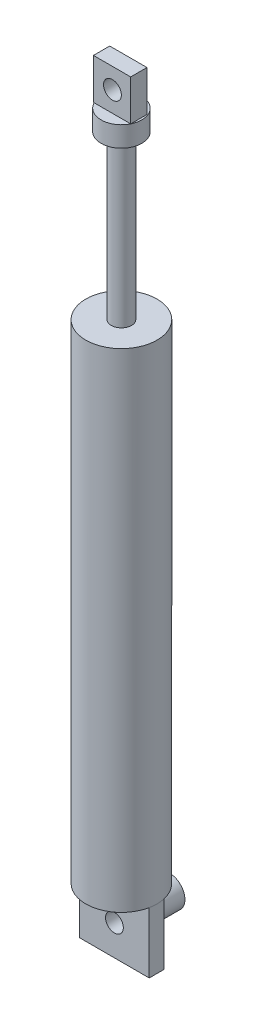
ISO-10303-21;
HEADER;
FILE_DESCRIPTION(('STEP AP214'),'2;1');
FILE_NAME('part.step','',(''),(''),'','','');
FILE_SCHEMA(('AUTOMOTIVE_DESIGN { 1 0 10303 214 1 1 1 1 }'));
ENDSEC;
DATA;
#1=APPLICATION_CONTEXT('core data for automotive mechanical design processes');
#2=APPLICATION_PROTOCOL_DEFINITION('international standard','automotive_design',2000,#1);
#3=PRODUCT_CONTEXT('',#1,'mechanical');
#4=PRODUCT('Part','Part','',(#3));
#5=PRODUCT_RELATED_PRODUCT_CATEGORY('part','',(#4));
#6=PRODUCT_DEFINITION_FORMATION('','',#4);
#7=PRODUCT_DEFINITION_CONTEXT('part definition',#1,'design');
#8=PRODUCT_DEFINITION('design','',#6,#7);
#9=PRODUCT_DEFINITION_SHAPE('','',#8);
#10=(LENGTH_UNIT() NAMED_UNIT(*) SI_UNIT(.MILLI.,.METRE.));
#11=(NAMED_UNIT(*) PLANE_ANGLE_UNIT() SI_UNIT($,.RADIAN.));
#12=(NAMED_UNIT(*) SI_UNIT($,.STERADIAN.) SOLID_ANGLE_UNIT());
#13=UNCERTAINTY_MEASURE_WITH_UNIT(LENGTH_MEASURE(1.E-05),#10,'distance_accuracy_value','');
#14=(GEOMETRIC_REPRESENTATION_CONTEXT(3) GLOBAL_UNCERTAINTY_ASSIGNED_CONTEXT((#13)) GLOBAL_UNIT_ASSIGNED_CONTEXT((#10,
#11,#12)) REPRESENTATION_CONTEXT('',''));
#15=CARTESIAN_POINT('',(0.,0.,0.));
#16=DIRECTION('',(0.,0.,1.));
#17=DIRECTION('',(1.,0.,0.));
#18=AXIS2_PLACEMENT_3D('',#15,#16,#17);
#19=CARTESIAN_POINT('',(0.,209.55,0.));
#20=DIRECTION('',(0.,1.,0.));
#21=DIRECTION('',(0.,0.,1.));
#22=AXIS2_PLACEMENT_3D('',#19,#20,#21);
#23=PLANE('',#22);
#24=DIRECTION('',(1.,0.,0.));
#25=VECTOR('',#24,1.);
#26=CARTESIAN_POINT('',(5.69608554617942,209.55,2.80661886450688));
#27=LINE('',#26,#25);
#28=CARTESIAN_POINT('',(-5.69608554617942,209.55,2.80661886450688));
#29=VERTEX_POINT('',#28);
#30=CARTESIAN_POINT('',(5.69608554617942,209.55,2.80661886450688));
#31=VERTEX_POINT('',#30);
#32=EDGE_CURVE('E11',#29,#31,#27,.T.);
#33=ORIENTED_EDGE('',*,*,#32,.F.);
#34=CARTESIAN_POINT('',(0.,209.55,0.));
#35=DIRECTION('',(0.,1.,0.));
#36=DIRECTION('',(0.,0.,1.));
#37=AXIS2_PLACEMENT_3D('',#34,#35,#36);
#38=CIRCLE('',#37,6.35);
#39=EDGE_CURVE('E136',#29,#31,#38,.T.);
#40=ORIENTED_EDGE('',*,*,#39,.T.);
#41=EDGE_LOOP('',(#33,#40));
#42=FACE_BOUND('',#41,.T.);
#43=ADVANCED_FACE('F33',(#42),#23,.T.);
#44=DIRECTION('',(0.,0.,-1.));
#45=VECTOR('',#44,1.);
#46=CARTESIAN_POINT('',(5.69608554617942,209.55,2.80661886450688));
#47=LINE('',#46,#45);
#48=CARTESIAN_POINT('',(5.69608554617942,209.55,-2.27338113549312));
#49=VERTEX_POINT('',#48);
#50=EDGE_CURVE('E132',#31,#49,#47,.T.);
#51=ORIENTED_EDGE('',*,*,#50,.F.);
#52=CARTESIAN_POINT('',(-5.92910096159477,209.55,-2.27338113549312));
#53=VERTEX_POINT('',#52);
#54=EDGE_CURVE('E142',#31,#53,#38,.T.);
#55=ORIENTED_EDGE('',*,*,#54,.T.);
#56=DIRECTION('',(-1.,0.,0.));
#57=VECTOR('',#56,1.);
#58=CARTESIAN_POINT('',(5.69608554617942,209.55,-2.27338113549312));
#59=LINE('',#58,#57);
#60=EDGE_CURVE('E50',#49,#53,#59,.T.);
#61=ORIENTED_EDGE('',*,*,#60,.F.);
#62=EDGE_LOOP('',(#51,#55,#61));
#63=FACE_BOUND('',#62,.T.);
#64=ADVANCED_FACE('F241',(#63),#23,.T.);
#65=CARTESIAN_POINT('',(10.8607540566693,-19.05,-2.35195186399306));
#66=DIRECTION('',(0.,0.,1.));
#67=DIRECTION('',(1.,0.,0.));
#68=AXIS2_PLACEMENT_3D('',#65,#66,#67);
#69=PLANE('',#68);
#70=DIRECTION('',(1.,0.,0.));
#71=VECTOR('',#70,1.);
#72=CARTESIAN_POINT('',(10.8607540566693,0.,-2.35195186399306));
#73=LINE('',#72,#71);
#74=CARTESIAN_POINT('',(-10.8967614385546,0.,-2.35195186399306));
#75=VERTEX_POINT('',#74);
#76=CARTESIAN_POINT('',(-10.8607540566693,0.,-2.35195186399306));
#77=VERTEX_POINT('',#76);
#78=EDGE_CURVE('E159',#75,#77,#73,.T.);
#79=ORIENTED_EDGE('',*,*,#78,.T.);
#80=CARTESIAN_POINT('',(10.8607540566693,0.,-2.35195186399306));
#81=VERTEX_POINT('',#80);
#82=EDGE_CURVE('E177',#77,#81,#73,.T.);
#83=ORIENTED_EDGE('',*,*,#82,.T.);
#84=DIRECTION('',(0.,1.,0.));
#85=VECTOR('',#84,1.);
#86=CARTESIAN_POINT('',(10.8607540566693,-19.05,-2.35195186399306));
#87=LINE('',#86,#85);
#88=CARTESIAN_POINT('',(10.8607540566693,-19.05,-2.35195186399306));
#89=VERTEX_POINT('',#88);
#90=EDGE_CURVE('E165',#89,#81,#87,.T.);
#91=ORIENTED_EDGE('',*,*,#90,.F.);
#92=DIRECTION('',(1.,0.,0.));
#93=VECTOR('',#92,1.);
#94=CARTESIAN_POINT('',(10.8607540566693,-19.05,-2.35195186399306));
#95=LINE('',#94,#93);
#96=CARTESIAN_POINT('',(-10.8967614385546,-19.05,-2.35195186399306));
#97=VERTEX_POINT('',#96);
#98=EDGE_CURVE('E163',#97,#89,#95,.T.);
#99=ORIENTED_EDGE('',*,*,#98,.F.);
#100=DIRECTION('',(0.,1.,0.));
#101=VECTOR('',#100,1.);
#102=CARTESIAN_POINT('',(-10.8967614385546,-19.05,-2.35195186399306));
#103=LINE('',#102,#101);
#104=EDGE_CURVE('E180',#97,#75,#103,.T.);
#105=ORIENTED_EDGE('',*,*,#104,.T.);
#106=EDGE_LOOP('',(#79,#83,#91,#99,#105));
#107=FACE_BOUND('',#106,.T.);
#108=CARTESIAN_POINT('',(0.,-9.525,-2.35195186399306));
#109=DIRECTION('',(0.,0.,1.));
#110=DIRECTION('',(1.,0.,0.));
#111=AXIS2_PLACEMENT_3D('',#108,#109,#110);
#112=CIRCLE('',#111,4.7625);
#113=CARTESIAN_POINT('',(4.7625,-9.525,-2.35195186399306));
#114=VERTEX_POINT('',#113);
#115=EDGE_CURVE('E37',#114,#114,#112,.F.);
#116=ORIENTED_EDGE('',*,*,#115,.F.);
#117=EDGE_LOOP('',(#116));
#118=FACE_BOUND('',#117,.T.);
#119=ADVANCED_FACE('F231',(#107,#118),#69,.F.);
#120=CARTESIAN_POINT('',(0.,0.,0.));
#121=DIRECTION('',(0.,1.,0.));
#122=DIRECTION('',(0.,0.,1.));
#123=AXIS2_PLACEMENT_3D('',#120,#121,#122);
#124=PLANE('',#123);
#125=ORIENTED_EDGE('',*,*,#82,.F.);
#126=CARTESIAN_POINT('',(0.,0.,0.));
#127=DIRECTION('',(0.,1.,0.));
#128=DIRECTION('',(0.,0.,1.));
#129=AXIS2_PLACEMENT_3D('',#126,#127,#128);
#130=CIRCLE('',#129,11.1125);
#131=EDGE_CURVE('E198',#81,#77,#130,.T.);
#132=ORIENTED_EDGE('',*,*,#131,.F.);
#133=EDGE_LOOP('',(#125,#132));
#134=FACE_BOUND('',#133,.T.);
#135=ADVANCED_FACE('F240',(#134),#124,.F.);
#136=DIRECTION('',(0.,0.,1.));
#137=VECTOR('',#136,1.);
#138=CARTESIAN_POINT('',(10.8607540566693,0.,-2.35195186399306));
#139=LINE('',#138,#137);
#140=CARTESIAN_POINT('',(10.8607540566693,0.,2.17904713148428));
#141=VERTEX_POINT('',#140);
#142=EDGE_CURVE('E154',#81,#141,#139,.T.);
#143=ORIENTED_EDGE('',*,*,#142,.F.);
#144=CARTESIAN_POINT('',(-10.8967614385546,0.,2.17904713148428));
#145=VERTEX_POINT('',#144);
#146=EDGE_CURVE('E193',#145,#81,#130,.T.);
#147=ORIENTED_EDGE('',*,*,#146,.F.);
#148=DIRECTION('',(-1.,0.,0.));
#149=VECTOR('',#148,1.);
#150=CARTESIAN_POINT('',(10.8607540566693,0.,2.17904713148428));
#151=LINE('',#150,#149);
#152=EDGE_CURVE('E168',#141,#145,#151,.T.);
#153=ORIENTED_EDGE('',*,*,#152,.F.);
#154=EDGE_LOOP('',(#143,#147,#153));
#155=FACE_BOUND('',#154,.T.);
#156=ADVANCED_FACE('F212',(#155),#124,.F.);
#157=DIRECTION('',(0.,0.,-1.));
#158=VECTOR('',#157,1.);
#159=CARTESIAN_POINT('',(-10.8967614385546,0.,-2.35195186399306));
#160=LINE('',#159,#158);
#161=CARTESIAN_POINT('',(-10.8967614385546,0.,-2.17904713148428));
#162=VERTEX_POINT('',#161);
#163=EDGE_CURVE('E172',#145,#162,#160,.T.);
#164=ORIENTED_EDGE('',*,*,#163,.F.);
#165=EDGE_CURVE('E206',#162,#145,#130,.T.);
#166=ORIENTED_EDGE('',*,*,#165,.F.);
#167=EDGE_LOOP('',(#164,#166));
#168=FACE_BOUND('',#167,.T.);
#169=ADVANCED_FACE('F213',(#168),#124,.F.);
#170=CARTESIAN_POINT('',(0.,152.4,0.));
#171=DIRECTION('',(0.,-1.,0.));
#172=DIRECTION('',(0.,0.,-1.));
#173=AXIS2_PLACEMENT_3D('',#170,#171,#172);
#174=CYLINDRICAL_SURFACE('',#173,11.1125);
#175=CARTESIAN_POINT('',(0.,152.4,0.));
#176=DIRECTION('',(0.,1.,0.));
#177=DIRECTION('',(0.,0.,1.));
#178=AXIS2_PLACEMENT_3D('',#175,#176,#177);
#179=CIRCLE('',#178,11.1125);
#180=CARTESIAN_POINT('',(0.,152.4,11.1125));
#181=VERTEX_POINT('',#180);
#182=EDGE_CURVE('E196',#181,#181,#179,.T.);
#183=ORIENTED_EDGE('',*,*,#182,.F.);
#184=EDGE_LOOP('',(#183));
#185=FACE_BOUND('',#184,.T.);
#186=ORIENTED_EDGE('',*,*,#131,.T.);
#187=EDGE_CURVE('E200',#77,#162,#130,.T.);
#188=ORIENTED_EDGE('',*,*,#187,.T.);
#189=ORIENTED_EDGE('',*,*,#165,.T.);
#190=ORIENTED_EDGE('',*,*,#146,.T.);
#191=EDGE_LOOP('',(#186,#188,#189,#190));
#192=FACE_BOUND('',#191,.T.);
#193=ADVANCED_FACE('F35',(#185,#192),#174,.T.);
#194=CARTESIAN_POINT('',(0.,152.4,0.));
#195=DIRECTION('',(0.,1.,0.));
#196=DIRECTION('',(0.,0.,1.));
#197=AXIS2_PLACEMENT_3D('',#194,#195,#196);
#198=PLANE('',#197);
#199=CARTESIAN_POINT('',(0.,152.4,0.));
#200=DIRECTION('',(0.,1.,0.));
#201=DIRECTION('',(0.,0.,1.));
#202=AXIS2_PLACEMENT_3D('',#199,#200,#201);
#203=CIRCLE('',#202,3.175);
#204=CARTESIAN_POINT('',(0.,152.4,3.175));
#205=VERTEX_POINT('',#204);
#206=EDGE_CURVE('E189',#205,#205,#203,.T.);
#207=ORIENTED_EDGE('',*,*,#206,.F.);
#208=EDGE_LOOP('',(#207));
#209=FACE_BOUND('',#208,.T.);
#210=ORIENTED_EDGE('',*,*,#182,.T.);
#211=EDGE_LOOP('',(#210));
#212=FACE_BOUND('',#211,.T.);
#213=ADVANCED_FACE('F463',(#209,#212),#198,.T.);
#214=CARTESIAN_POINT('',(0.,203.2,0.));
#215=DIRECTION('',(0.,-1.,0.));
#216=DIRECTION('',(0.,0.,-1.));
#217=AXIS2_PLACEMENT_3D('',#214,#215,#216);
#218=CYLINDRICAL_SURFACE('',#217,3.175);
#219=CARTESIAN_POINT('',(0.,203.2,0.));
#220=DIRECTION('',(0.,1.,0.));
#221=DIRECTION('',(0.,0.,1.));
#222=AXIS2_PLACEMENT_3D('',#219,#220,#221);
#223=CIRCLE('',#222,3.175);
#224=CARTESIAN_POINT('',(0.,203.2,3.175));
#225=VERTEX_POINT('',#224);
#226=EDGE_CURVE('E190',#225,#225,#223,.T.);
#227=ORIENTED_EDGE('',*,*,#226,.F.);
#228=EDGE_LOOP('',(#227));
#229=FACE_BOUND('',#228,.T.);
#230=ORIENTED_EDGE('',*,*,#206,.T.);
#231=EDGE_LOOP('',(#230));
#232=FACE_BOUND('',#231,.T.);
#233=ADVANCED_FACE('F452',(#229,#232),#218,.T.);
#234=CARTESIAN_POINT('',(10.8607540566693,-19.05,-2.35195186399306));
#235=DIRECTION('',(-1.,0.,0.));
#236=DIRECTION('',(0.,0.,1.));
#237=AXIS2_PLACEMENT_3D('',#234,#235,#236);
#238=PLANE('',#237);
#239=ORIENTED_EDGE('',*,*,#142,.T.);
#240=DIRECTION('',(0.,1.,0.));
#241=VECTOR('',#240,1.);
#242=CARTESIAN_POINT('',(10.8607540566693,-19.05,2.17904713148428));
#243=LINE('',#242,#241);
#244=CARTESIAN_POINT('',(10.8607540566693,-19.05,2.17904713148428));
#245=VERTEX_POINT('',#244);
#246=EDGE_CURVE('E186',#245,#141,#243,.T.);
#247=ORIENTED_EDGE('',*,*,#246,.F.);
#248=DIRECTION('',(0.,0.,1.));
#249=VECTOR('',#248,1.);
#250=CARTESIAN_POINT('',(10.8607540566693,-19.05,-2.35195186399306));
#251=LINE('',#250,#249);
#252=EDGE_CURVE('E155',#89,#245,#251,.T.);
#253=ORIENTED_EDGE('',*,*,#252,.F.);
#254=ORIENTED_EDGE('',*,*,#90,.T.);
#255=EDGE_LOOP('',(#239,#247,#253,#254));
#256=FACE_BOUND('',#255,.T.);
#257=ADVANCED_FACE('F228',(#256),#238,.F.);
#258=CARTESIAN_POINT('',(10.8607540566693,-19.05,2.17904713148428));
#259=DIRECTION('',(0.,0.,-1.));
#260=DIRECTION('',(-1.,0.,0.));
#261=AXIS2_PLACEMENT_3D('',#258,#259,#260);
#262=PLANE('',#261);
#263=CARTESIAN_POINT('',(0.,-9.525,2.17904713148428));
#264=DIRECTION('',(0.,0.,1.));
#265=DIRECTION('',(1.,0.,0.));
#266=AXIS2_PLACEMENT_3D('',#263,#264,#265);
#267=CIRCLE('',#266,2.778125);
#268=CARTESIAN_POINT('',(2.778125,-9.525,2.17904713148427));
#269=VERTEX_POINT('',#268);
#270=EDGE_CURVE('E151',#269,#269,#267,.T.);
#271=ORIENTED_EDGE('',*,*,#270,.F.);
#272=EDGE_LOOP('',(#271));
#273=FACE_BOUND('',#272,.T.);
#274=ORIENTED_EDGE('',*,*,#152,.T.);
#275=DIRECTION('',(0.,1.,0.));
#276=VECTOR('',#275,1.);
#277=CARTESIAN_POINT('',(-10.8967614385546,-19.05,2.17904713148428));
#278=LINE('',#277,#276);
#279=CARTESIAN_POINT('',(-10.8967614385546,-19.05,2.17904713148428));
#280=VERTEX_POINT('',#279);
#281=EDGE_CURVE('E183',#280,#145,#278,.T.);
#282=ORIENTED_EDGE('',*,*,#281,.F.);
#283=DIRECTION('',(-1.,0.,0.));
#284=VECTOR('',#283,1.);
#285=CARTESIAN_POINT('',(10.8607540566693,-19.05,2.17904713148428));
#286=LINE('',#285,#284);
#287=EDGE_CURVE('E158',#245,#280,#286,.T.);
#288=ORIENTED_EDGE('',*,*,#287,.F.);
#289=ORIENTED_EDGE('',*,*,#246,.T.);
#290=EDGE_LOOP('',(#274,#282,#288,#289));
#291=FACE_BOUND('',#290,.T.);
#292=ADVANCED_FACE('F217',(#273,#291),#262,.F.);
#293=CARTESIAN_POINT('',(-10.8967614385546,-19.05,-2.35195186399306));
#294=DIRECTION('',(1.,0.,0.));
#295=DIRECTION('',(0.,0.,-1.));
#296=AXIS2_PLACEMENT_3D('',#293,#294,#295);
#297=PLANE('',#296);
#298=ORIENTED_EDGE('',*,*,#163,.T.);
#299=EDGE_CURVE('E171',#162,#75,#160,.T.);
#300=ORIENTED_EDGE('',*,*,#299,.T.);
#301=ORIENTED_EDGE('',*,*,#104,.F.);
#302=DIRECTION('',(0.,0.,-1.));
#303=VECTOR('',#302,1.);
#304=CARTESIAN_POINT('',(-10.8967614385546,-19.05,-2.35195186399306));
#305=LINE('',#304,#303);
#306=EDGE_CURVE('E161',#280,#97,#305,.T.);
#307=ORIENTED_EDGE('',*,*,#306,.F.);
#308=ORIENTED_EDGE('',*,*,#281,.T.);
#309=EDGE_LOOP('',(#298,#300,#301,#307,#308));
#310=FACE_BOUND('',#309,.T.);
#311=ADVANCED_FACE('F220',(#310),#297,.F.);
#312=CARTESIAN_POINT('',(0.,-19.05,0.));
#313=DIRECTION('',(0.,-1.,0.));
#314=DIRECTION('',(0.,0.,-1.));
#315=AXIS2_PLACEMENT_3D('',#312,#313,#314);
#316=PLANE('',#315);
#317=ORIENTED_EDGE('',*,*,#252,.T.);
#318=ORIENTED_EDGE('',*,*,#287,.T.);
#319=ORIENTED_EDGE('',*,*,#306,.T.);
#320=ORIENTED_EDGE('',*,*,#98,.T.);
#321=EDGE_LOOP('',(#317,#318,#319,#320));
#322=FACE_BOUND('',#321,.T.);
#323=ADVANCED_FACE('F224',(#322),#316,.T.);
#324=CARTESIAN_POINT('',(0.,0.,0.));
#325=DIRECTION('',(0.,-1.,0.));
#326=DIRECTION('',(0.,0.,-1.));
#327=AXIS2_PLACEMENT_3D('',#324,#325,#326);
#328=PLANE('',#327);
#329=ORIENTED_EDGE('',*,*,#187,.F.);
#330=ORIENTED_EDGE('',*,*,#78,.F.);
#331=ORIENTED_EDGE('',*,*,#299,.F.);
#332=EDGE_LOOP('',(#329,#330,#331));
#333=FACE_BOUND('',#332,.T.);
#334=ADVANCED_FACE('F404',(#333),#328,.F.);
#335=CARTESIAN_POINT('',(0.,-9.525,-16.8709528685157));
#336=DIRECTION('',(0.,0.,1.));
#337=DIRECTION('',(1.,0.,0.));
#338=AXIS2_PLACEMENT_3D('',#335,#336,#337);
#339=CYLINDRICAL_SURFACE('',#338,2.778125);
#340=CARTESIAN_POINT('',(0.,-9.525,-15.0519518639931));
#341=DIRECTION('',(0.,0.,-1.));
#342=DIRECTION('',(-1.,0.,0.));
#343=AXIS2_PLACEMENT_3D('',#340,#341,#342);
#344=CIRCLE('',#343,2.778125);
#345=CARTESIAN_POINT('',(2.778125,-9.525,-15.0519518639931));
#346=VERTEX_POINT('',#345);
#347=EDGE_CURVE('E143',#346,#346,#344,.T.);
#348=CARTESIAN_POINT('',(2.778125,-9.525,2.17904713148427));
#349=CARTESIAN_POINT('',(2.778125,-9.525,1.99955755861472));
#350=CARTESIAN_POINT('',(2.778125,-9.525,1.82006798574516));
#351=CARTESIAN_POINT('',(2.778125,-9.525,1.46108884000605));
#352=CARTESIAN_POINT('',(2.778125,-9.525,1.2815992671365));
#353=CARTESIAN_POINT('',(2.778125,-9.525,0.922620121397386));
#354=CARTESIAN_POINT('',(2.778125,-9.525,0.74313054852783));
#355=CARTESIAN_POINT('',(2.778125,-9.525,0.384151402788718));
#356=CARTESIAN_POINT('',(2.778125,-9.525,0.204661829919163));
#357=CARTESIAN_POINT('',(2.778125,-9.525,-0.154317315819948));
#358=CARTESIAN_POINT('',(2.778125,-9.525,-0.333806888689503));
#359=CARTESIAN_POINT('',(2.778125,-9.525,-0.692786034428615));
#360=CARTESIAN_POINT('',(2.778125,-9.525,-0.872275607298171));
#361=CARTESIAN_POINT('',(2.778125,-9.525,-1.23125475303728));
#362=CARTESIAN_POINT('',(2.778125,-9.525,-1.41074432590684));
#363=CARTESIAN_POINT('',(2.778125,-9.525,-1.76972347164595));
#364=CARTESIAN_POINT('',(2.778125,-9.525,-1.9492130445155));
#365=CARTESIAN_POINT('',(2.778125,-9.525,-2.30819219025461));
#366=CARTESIAN_POINT('',(2.778125,-9.525,-2.48768176312417));
#367=CARTESIAN_POINT('',(2.778125,-9.525,-2.84666090886328));
#368=CARTESIAN_POINT('',(2.778125,-9.525,-3.02615048173284));
#369=CARTESIAN_POINT('',(2.778125,-9.525,-3.38512962747195));
#370=CARTESIAN_POINT('',(2.778125,-9.525,-3.5646192003415));
#371=CARTESIAN_POINT('',(2.778125,-9.525,-3.92359834608061));
#372=CARTESIAN_POINT('',(2.778125,-9.525,-4.10308791895017));
#373=CARTESIAN_POINT('',(2.778125,-9.525,-4.46206706468928));
#374=CARTESIAN_POINT('',(2.778125,-9.525,-4.64155663755884));
#375=CARTESIAN_POINT('',(2.778125,-9.525,-5.00053578329795));
#376=CARTESIAN_POINT('',(2.778125,-9.525,-5.1800253561675));
#377=CARTESIAN_POINT('',(2.778125,-9.525,-5.53900450190661));
#378=CARTESIAN_POINT('',(2.778125,-9.525,-5.71849407477617));
#379=CARTESIAN_POINT('',(2.778125,-9.525,-6.07747322051528));
#380=CARTESIAN_POINT('',(2.778125,-9.525,-6.25696279338484));
#381=CARTESIAN_POINT('',(2.778125,-9.525,-6.61594193912395));
#382=CARTESIAN_POINT('',(2.778125,-9.525,-6.7954315119935));
#383=CARTESIAN_POINT('',(2.778125,-9.525,-7.15441065773261));
#384=CARTESIAN_POINT('',(2.778125,-9.525,-7.33390023060217));
#385=CARTESIAN_POINT('',(2.778125,-9.525,-7.69287937634128));
#386=CARTESIAN_POINT('',(2.778125,-9.525,-7.87236894921084));
#387=CARTESIAN_POINT('',(2.778125,-9.525,-8.23134809494995));
#388=CARTESIAN_POINT('',(2.778125,-9.525,-8.4108376678195));
#389=CARTESIAN_POINT('',(2.778125,-9.525,-8.76981681355861));
#390=CARTESIAN_POINT('',(2.778125,-9.525,-8.94930638642817));
#391=CARTESIAN_POINT('',(2.778125,-9.525,-9.30828553216728));
#392=CARTESIAN_POINT('',(2.778125,-9.525,-9.48777510503684));
#393=CARTESIAN_POINT('',(2.778125,-9.525,-9.84675425077595));
#394=CARTESIAN_POINT('',(2.778125,-9.525,-10.0262438236455));
#395=CARTESIAN_POINT('',(2.778125,-9.525,-10.3852229693846));
#396=CARTESIAN_POINT('',(2.778125,-9.525,-10.5647125422542));
#397=CARTESIAN_POINT('',(2.778125,-9.525,-10.9236916879933));
#398=CARTESIAN_POINT('',(2.778125,-9.525,-11.1031812608628));
#399=CARTESIAN_POINT('',(2.778125,-9.525,-11.4621604066019));
#400=CARTESIAN_POINT('',(2.778125,-9.525,-11.6416499794715));
#401=CARTESIAN_POINT('',(2.778125,-9.525,-12.0006291252106));
#402=CARTESIAN_POINT('',(2.778125,-9.525,-12.1801186980802));
#403=CARTESIAN_POINT('',(2.778125,-9.525,-12.5390978438193));
#404=CARTESIAN_POINT('',(2.778125,-9.525,-12.7185874166888));
#405=CARTESIAN_POINT('',(2.778125,-9.525,-13.0775665624279));
#406=CARTESIAN_POINT('',(2.778125,-9.525,-13.2570561352975));
#407=CARTESIAN_POINT('',(2.778125,-9.525,-13.6160352810366));
#408=CARTESIAN_POINT('',(2.778125,-9.525,-13.7955248539062));
#409=CARTESIAN_POINT('',(2.778125,-9.525,-14.1545039996453));
#410=CARTESIAN_POINT('',(2.778125,-9.525,-14.3339935725148));
#411=CARTESIAN_POINT('',(2.778125,-9.525,-14.6929727182539));
#412=CARTESIAN_POINT('',(2.778125,-9.525,-14.8724622911235));
#413=CARTESIAN_POINT('',(2.778125,-9.525,-15.0519518639931));
#414=B_SPLINE_CURVE_WITH_KNOTS('',3,(#348,#349,#350,#351,#352,#353,#354,#355,#356,#357,#358,
#359,#360,#361,#362,#363,#364,#365,#366,#367,#368,#369,#370,#371,#372,#373,#374,#375,#376,#377,
#378,#379,#380,#381,#382,#383,#384,#385,#386,#387,#388,#389,#390,#391,#392,#393,#394,#395,#396,
#397,#398,#399,#400,#401,#402,#403,#404,#405,#406,#407,#408,#409,#410,#411,#412,#413),
.UNSPECIFIED.,.F.,.F.,(4,2,2,2,2,2,2,2,2,2,2,2,2,2,2,2,2,2,2,2,2,2,2,2,2,2,2,2,2,2,2,2,4),(0.,
0.538468718608666,1.07693743721733,1.615406155826,2.15387487443467,2.69234359304333,
3.230812311652,3.76928103026067,4.30774974886933,4.846218467478,5.38468718608667,
5.92315590469533,6.461624623304,7.00009334191267,7.53856206052133,8.07703077913,
8.61549949773867,9.15396821634733,9.692436934956,10.2309056535647,10.7693743721733,
11.307843090782,11.8463118093907,12.3847805279993,12.923249246608,13.4617179652167,
14.0001866838253,14.538655402434,15.0771241210427,15.6155928396513,16.15406155826,
16.6925302768687,17.2309989954773),.UNSPECIFIED.);
#415=EDGE_CURVE('BSEAM395',#269,#346,#414,.T.);
#416=ORIENTED_EDGE('',*,*,#270,.T.);
#417=ORIENTED_EDGE('',*,*,#347,.T.);
#418=ORIENTED_EDGE('',*,*,#415,.T.);
#419=ORIENTED_EDGE('',*,*,#415,.F.);
#420=EDGE_LOOP('',(#416,#418,#417,#419));
#421=FACE_BOUND('',#420,.T.);
#422=ADVANCED_FACE('F395',(#421),#339,.F.);
#423=CARTESIAN_POINT('',(0.,-9.525,-15.0519518639931));
#424=DIRECTION('',(0.,0.,-1.));
#425=DIRECTION('',(-1.,0.,0.));
#426=AXIS2_PLACEMENT_3D('',#423,#424,#425);
#427=PLANE('',#426);
#428=CARTESIAN_POINT('',(0.,-9.525,-15.0519518639931));
#429=DIRECTION('',(0.,0.,-1.));
#430=DIRECTION('',(-1.,0.,0.));
#431=AXIS2_PLACEMENT_3D('',#428,#429,#430);
#432=CIRCLE('',#431,4.7625);
#433=CARTESIAN_POINT('',(-4.7625,-9.525,-15.0519518639931));
#434=VERTEX_POINT('',#433);
#435=EDGE_CURVE('E148',#434,#434,#432,.T.);
#436=ORIENTED_EDGE('',*,*,#435,.T.);
#437=EDGE_LOOP('',(#436));
#438=FACE_BOUND('',#437,.T.);
#439=ORIENTED_EDGE('',*,*,#347,.F.);
#440=EDGE_LOOP('',(#439));
#441=FACE_BOUND('',#440,.T.);
#442=ADVANCED_FACE('F385',(#438,#441),#427,.T.);
#443=CARTESIAN_POINT('',(0.,-9.525,-15.0519518639931));
#444=DIRECTION('',(0.,0.,1.));
#445=DIRECTION('',(1.,0.,0.));
#446=AXIS2_PLACEMENT_3D('',#443,#444,#445);
#447=CYLINDRICAL_SURFACE('',#446,4.7625);
#448=ORIENTED_EDGE('',*,*,#435,.F.);
#449=EDGE_LOOP('',(#448));
#450=FACE_BOUND('',#449,.T.);
#451=ORIENTED_EDGE('',*,*,#115,.T.);
#452=EDGE_LOOP('',(#451));
#453=FACE_BOUND('',#452,.T.);
#454=ADVANCED_FACE('F238',(#450,#453),#447,.T.);
#455=CARTESIAN_POINT('',(0.,209.55,0.));
#456=DIRECTION('',(0.,-1.,0.));
#457=DIRECTION('',(0.,0.,-1.));
#458=AXIS2_PLACEMENT_3D('',#455,#456,#457);
#459=CYLINDRICAL_SURFACE('',#458,6.35);
#460=ORIENTED_EDGE('',*,*,#54,.F.);
#461=ORIENTED_EDGE('',*,*,#39,.F.);
#462=CARTESIAN_POINT('',(-5.92910096159477,209.55,2.27338113549312));
#463=VERTEX_POINT('',#462);
#464=EDGE_CURVE('E293',#463,#29,#38,.T.);
#465=ORIENTED_EDGE('',*,*,#464,.F.);
#466=EDGE_CURVE('E144',#53,#463,#38,.T.);
#467=ORIENTED_EDGE('',*,*,#466,.F.);
#468=EDGE_LOOP('',(#460,#461,#465,#467));
#469=FACE_BOUND('',#468,.T.);
#470=CARTESIAN_POINT('',(0.,203.2,0.));
#471=DIRECTION('',(0.,1.,0.));
#472=DIRECTION('',(0.,0.,1.));
#473=AXIS2_PLACEMENT_3D('',#470,#471,#472);
#474=CIRCLE('',#473,6.35);
#475=CARTESIAN_POINT('',(0.,203.2,6.35));
#476=VERTEX_POINT('',#475);
#477=EDGE_CURVE('E133',#476,#476,#474,.T.);
#478=ORIENTED_EDGE('',*,*,#477,.T.);
#479=EDGE_LOOP('',(#478));
#480=FACE_BOUND('',#479,.T.);
#481=ADVANCED_FACE('F258',(#469,#480),#459,.T.);
#482=DIRECTION('',(0.,0.,1.));
#483=VECTOR('',#482,1.);
#484=CARTESIAN_POINT('',(-5.92910096159477,209.55,2.80661886450688));
#485=LINE('',#484,#483);
#486=EDGE_CURVE('E271',#53,#463,#485,.T.);
#487=ORIENTED_EDGE('',*,*,#486,.F.);
#488=ORIENTED_EDGE('',*,*,#466,.T.);
#489=EDGE_LOOP('',(#487,#488));
#490=FACE_BOUND('',#489,.T.);
#491=ADVANCED_FACE('F248',(#490),#23,.T.);
#492=CARTESIAN_POINT('',(0.,203.2,0.));
#493=DIRECTION('',(0.,1.,0.));
#494=DIRECTION('',(0.,0.,1.));
#495=AXIS2_PLACEMENT_3D('',#492,#493,#494);
#496=PLANE('',#495);
#497=ORIENTED_EDGE('',*,*,#226,.T.);
#498=EDGE_LOOP('',(#497));
#499=FACE_BOUND('',#498,.T.);
#500=ORIENTED_EDGE('',*,*,#477,.F.);
#501=EDGE_LOOP('',(#500));
#502=FACE_BOUND('',#501,.T.);
#503=ADVANCED_FACE('F257',(#499,#502),#496,.F.);
#504=CARTESIAN_POINT('',(0.,209.55,0.));
#505=DIRECTION('',(0.,1.,0.));
#506=DIRECTION('',(0.,0.,1.));
#507=AXIS2_PLACEMENT_3D('',#504,#505,#506);
#508=PLANE('',#507);
#509=CARTESIAN_POINT('',(-5.92910096159477,209.55,2.80661886450688));
#510=VERTEX_POINT('',#509);
#511=EDGE_CURVE('E275',#463,#510,#485,.T.);
#512=ORIENTED_EDGE('',*,*,#511,.F.);
#513=ORIENTED_EDGE('',*,*,#464,.T.);
#514=EDGE_CURVE('E43',#510,#29,#27,.T.);
#515=ORIENTED_EDGE('',*,*,#514,.F.);
#516=EDGE_LOOP('',(#512,#513,#515));
#517=FACE_BOUND('',#516,.T.);
#518=ADVANCED_FACE('F264',(#517),#508,.F.);
#519=CARTESIAN_POINT('',(5.69608554617942,222.25,2.80661886450688));
#520=DIRECTION('',(-1.,0.,0.));
#521=DIRECTION('',(0.,0.,1.));
#522=AXIS2_PLACEMENT_3D('',#519,#520,#521);
#523=PLANE('',#522);
#524=ORIENTED_EDGE('',*,*,#50,.T.);
#525=DIRECTION('',(0.,-1.,0.));
#526=VECTOR('',#525,1.);
#527=CARTESIAN_POINT('',(5.69608554617942,222.25,-2.27338113549312));
#528=LINE('',#527,#526);
#529=CARTESIAN_POINT('',(5.69608554617942,222.25,-2.27338113549312));
#530=VERTEX_POINT('',#529);
#531=EDGE_CURVE('E114',#530,#49,#528,.T.);
#532=ORIENTED_EDGE('',*,*,#531,.F.);
#533=DIRECTION('',(0.,0.,-1.));
#534=VECTOR('',#533,1.);
#535=CARTESIAN_POINT('',(5.69608554617942,222.25,2.80661886450688));
#536=LINE('',#535,#534);
#537=CARTESIAN_POINT('',(5.69608554617942,222.25,2.80661886450688));
#538=VERTEX_POINT('',#537);
#539=EDGE_CURVE('E121',#538,#530,#536,.T.);
#540=ORIENTED_EDGE('',*,*,#539,.F.);
#541=DIRECTION('',(0.,-1.,0.));
#542=VECTOR('',#541,1.);
#543=CARTESIAN_POINT('',(5.69608554617942,222.25,2.80661886450688));
#544=LINE('',#543,#542);
#545=EDGE_CURVE('E282',#538,#31,#544,.T.);
#546=ORIENTED_EDGE('',*,*,#545,.T.);
#547=EDGE_LOOP('',(#524,#532,#540,#546));
#548=FACE_BOUND('',#547,.T.);
#549=ADVANCED_FACE('F131',(#548),#523,.F.);
#550=CARTESIAN_POINT('',(5.69608554617942,222.25,-2.27338113549312));
#551=DIRECTION('',(0.,0.,1.));
#552=DIRECTION('',(1.,0.,0.));
#553=AXIS2_PLACEMENT_3D('',#550,#551,#552);
#554=PLANE('',#553);
#555=CARTESIAN_POINT('',(0.,215.9,-2.27338113549312));
#556=DIRECTION('',(0.,0.,1.));
#557=DIRECTION('',(1.,0.,0.));
#558=AXIS2_PLACEMENT_3D('',#555,#556,#557);
#559=CIRCLE('',#558,2.77812500000001);
#560=CARTESIAN_POINT('',(2.77812500000001,215.9,-2.27338113549312));
#561=VERTEX_POINT('',#560);
#562=EDGE_CURVE('E285',#561,#561,#559,.T.);
#563=ORIENTED_EDGE('',*,*,#562,.T.);
#564=EDGE_LOOP('',(#563));
#565=FACE_BOUND('',#564,.T.);
#566=ORIENTED_EDGE('',*,*,#60,.T.);
#567=DIRECTION('',(0.,-1.,0.));
#568=VECTOR('',#567,1.);
#569=CARTESIAN_POINT('',(-5.92910096159477,222.25,-2.27338113549312));
#570=LINE('',#569,#568);
#571=CARTESIAN_POINT('',(-5.92910096159477,222.25,-2.27338113549312));
#572=VERTEX_POINT('',#571);
#573=EDGE_CURVE('E117',#572,#53,#570,.T.);
#574=ORIENTED_EDGE('',*,*,#573,.F.);
#575=DIRECTION('',(-1.,0.,0.));
#576=VECTOR('',#575,1.);
#577=CARTESIAN_POINT('',(5.69608554617942,222.25,-2.27338113549312));
#578=LINE('',#577,#576);
#579=EDGE_CURVE('E110',#530,#572,#578,.T.);
#580=ORIENTED_EDGE('',*,*,#579,.F.);
#581=ORIENTED_EDGE('',*,*,#531,.T.);
#582=EDGE_LOOP('',(#566,#574,#580,#581));
#583=FACE_BOUND('',#582,.T.);
#584=ADVANCED_FACE('F112',(#565,#583),#554,.F.);
#585=CARTESIAN_POINT('',(-5.92910096159477,222.25,2.80661886450688));
#586=DIRECTION('',(1.,0.,0.));
#587=DIRECTION('',(0.,0.,-1.));
#588=AXIS2_PLACEMENT_3D('',#585,#586,#587);
#589=PLANE('',#588);
#590=ORIENTED_EDGE('',*,*,#486,.T.);
#591=ORIENTED_EDGE('',*,*,#511,.T.);
#592=DIRECTION('',(0.,-1.,0.));
#593=VECTOR('',#592,1.);
#594=CARTESIAN_POINT('',(-5.92910096159477,222.25,2.80661886450688));
#595=LINE('',#594,#593);
#596=CARTESIAN_POINT('',(-5.92910096159477,222.25,2.80661886450688));
#597=VERTEX_POINT('',#596);
#598=EDGE_CURVE('E138',#597,#510,#595,.T.);
#599=ORIENTED_EDGE('',*,*,#598,.F.);
#600=DIRECTION('',(0.,0.,1.));
#601=VECTOR('',#600,1.);
#602=CARTESIAN_POINT('',(-5.92910096159477,222.25,2.80661886450688));
#603=LINE('',#602,#601);
#604=EDGE_CURVE('E120',#572,#597,#603,.T.);
#605=ORIENTED_EDGE('',*,*,#604,.F.);
#606=ORIENTED_EDGE('',*,*,#573,.T.);
#607=EDGE_LOOP('',(#590,#591,#599,#605,#606));
#608=FACE_BOUND('',#607,.T.);
#609=ADVANCED_FACE('F278',(#608),#589,.F.);
#610=CARTESIAN_POINT('',(5.69608554617942,222.25,2.80661886450688));
#611=DIRECTION('',(0.,0.,-1.));
#612=DIRECTION('',(-1.,0.,0.));
#613=AXIS2_PLACEMENT_3D('',#610,#611,#612);
#614=PLANE('',#613);
#615=CARTESIAN_POINT('',(0.,215.9,2.80661886450688));
#616=DIRECTION('',(0.,0.,1.));
#617=DIRECTION('',(1.,0.,0.));
#618=AXIS2_PLACEMENT_3D('',#615,#616,#617);
#619=CIRCLE('',#618,2.77812500000001);
#620=CARTESIAN_POINT('',(2.77812500000001,215.9,2.80661886450688));
#621=VERTEX_POINT('',#620);
#622=EDGE_CURVE('E318',#621,#621,#619,.T.);
#623=ORIENTED_EDGE('',*,*,#622,.F.);
#624=EDGE_LOOP('',(#623));
#625=FACE_BOUND('',#624,.T.);
#626=ORIENTED_EDGE('',*,*,#514,.T.);
#627=ORIENTED_EDGE('',*,*,#32,.T.);
#628=ORIENTED_EDGE('',*,*,#545,.F.);
#629=DIRECTION('',(1.,0.,0.));
#630=VECTOR('',#629,1.);
#631=CARTESIAN_POINT('',(5.69608554617942,222.25,2.80661886450688));
#632=LINE('',#631,#630);
#633=EDGE_CURVE('E126',#597,#538,#632,.T.);
#634=ORIENTED_EDGE('',*,*,#633,.F.);
#635=ORIENTED_EDGE('',*,*,#598,.T.);
#636=EDGE_LOOP('',(#626,#627,#628,#634,#635));
#637=FACE_BOUND('',#636,.T.);
#638=ADVANCED_FACE('F290',(#625,#637),#614,.F.);
#639=CARTESIAN_POINT('',(0.,222.25,0.));
#640=DIRECTION('',(0.,1.,0.));
#641=DIRECTION('',(0.,0.,1.));
#642=AXIS2_PLACEMENT_3D('',#639,#640,#641);
#643=PLANE('',#642);
#644=ORIENTED_EDGE('',*,*,#539,.T.);
#645=ORIENTED_EDGE('',*,*,#579,.T.);
#646=ORIENTED_EDGE('',*,*,#604,.T.);
#647=ORIENTED_EDGE('',*,*,#633,.T.);
#648=EDGE_LOOP('',(#644,#645,#646,#647));
#649=FACE_BOUND('',#648,.T.);
#650=ADVANCED_FACE('F124',(#649),#643,.T.);
#651=CARTESIAN_POINT('',(0.,215.9,-9.89338113549312));
#652=DIRECTION('',(0.,0.,1.));
#653=DIRECTION('',(1.,0.,0.));
#654=AXIS2_PLACEMENT_3D('',#651,#652,#653);
#655=CYLINDRICAL_SURFACE('',#654,2.77812500000001);
#656=ORIENTED_EDGE('',*,*,#622,.T.);
#657=EDGE_LOOP('',(#656));
#658=FACE_BOUND('',#657,.T.);
#659=ORIENTED_EDGE('',*,*,#562,.F.);
#660=EDGE_LOOP('',(#659));
#661=FACE_BOUND('',#660,.T.);
#662=ADVANCED_FACE('F324',(#658,#661),#655,.F.);
#663=CLOSED_SHELL('',(#43,#64,#119,#135,#156,#169,#193,#213,#233,#257,#292,#311,#323,#334,#422,
#442,#454,#481,#491,#503,#518,#549,#584,#609,#638,#650,#662));
#664=MANIFOLD_SOLID_BREP('B2',#663);
#665=ADVANCED_BREP_SHAPE_REPRESENTATION('',(#18,#664),#14);
#666=SHAPE_DEFINITION_REPRESENTATION(#9,#665);
ENDSEC;
END-ISO-10303-21;
